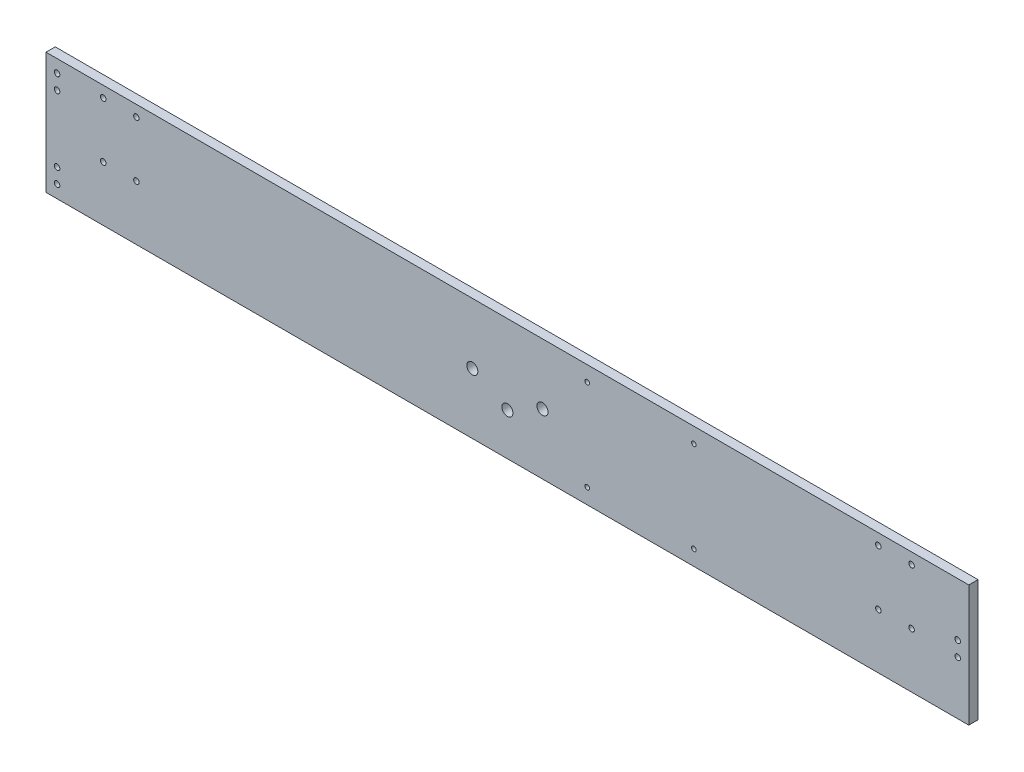
ISO-10303-21;
HEADER;
FILE_DESCRIPTION(('STEP AP214'),'2;1');
FILE_NAME('part.step','',(''),(''),'','','');
FILE_SCHEMA(('AUTOMOTIVE_DESIGN { 1 0 10303 214 1 1 1 1 }'));
ENDSEC;
DATA;
#1=APPLICATION_CONTEXT('core data for automotive mechanical design processes');
#2=APPLICATION_PROTOCOL_DEFINITION('international standard','automotive_design',2000,#1);
#3=PRODUCT_CONTEXT('',#1,'mechanical');
#4=PRODUCT('Part','Part','',(#3));
#5=PRODUCT_RELATED_PRODUCT_CATEGORY('part','',(#4));
#6=PRODUCT_DEFINITION_FORMATION('','',#4);
#7=PRODUCT_DEFINITION_CONTEXT('part definition',#1,'design');
#8=PRODUCT_DEFINITION('design','',#6,#7);
#9=PRODUCT_DEFINITION_SHAPE('','',#8);
#10=(LENGTH_UNIT() NAMED_UNIT(*) SI_UNIT(.MILLI.,.METRE.));
#11=(NAMED_UNIT(*) PLANE_ANGLE_UNIT() SI_UNIT($,.RADIAN.));
#12=(NAMED_UNIT(*) SI_UNIT($,.STERADIAN.) SOLID_ANGLE_UNIT());
#13=UNCERTAINTY_MEASURE_WITH_UNIT(LENGTH_MEASURE(1.E-05),#10,'distance_accuracy_value','');
#14=(GEOMETRIC_REPRESENTATION_CONTEXT(3) GLOBAL_UNCERTAINTY_ASSIGNED_CONTEXT((#13)) GLOBAL_UNIT_ASSIGNED_CONTEXT((#10,
#11,#12)) REPRESENTATION_CONTEXT('',''));
#15=CARTESIAN_POINT('',(0.,0.,0.));
#16=DIRECTION('',(0.,0.,1.));
#17=DIRECTION('',(1.,0.,0.));
#18=AXIS2_PLACEMENT_3D('',#15,#16,#17);
#19=CARTESIAN_POINT('',(0.,0.,5.));
#20=DIRECTION('',(0.,0.,1.));
#21=DIRECTION('',(1.,0.,0.));
#22=AXIS2_PLACEMENT_3D('',#19,#20,#21);
#23=PLANE('',#22);
#24=CARTESIAN_POINT('',(19.,0.,5.));
#25=DIRECTION('',(0.,0.,1.));
#26=DIRECTION('',(1.,0.,0.));
#27=AXIS2_PLACEMENT_3D('',#24,#25,#26);
#28=CIRCLE('',#27,3.);
#29=CARTESIAN_POINT('',(22.,0.,5.));
#30=VERTEX_POINT('',#29);
#31=EDGE_CURVE('E118',#30,#30,#28,.T.);
#32=ORIENTED_EDGE('',*,*,#31,.F.);
#33=EDGE_LOOP('',(#32));
#34=FACE_BOUND('',#33,.T.);
#35=CARTESIAN_POINT('',(-19.,0.,5.));
#36=DIRECTION('',(0.,0.,1.));
#37=DIRECTION('',(1.,0.,0.));
#38=AXIS2_PLACEMENT_3D('',#35,#36,#37);
#39=CIRCLE('',#38,3.);
#40=CARTESIAN_POINT('',(-16.,0.,5.));
#41=VERTEX_POINT('',#40);
#42=EDGE_CURVE('E501',#41,#41,#39,.T.);
#43=ORIENTED_EDGE('',*,*,#42,.F.);
#44=EDGE_LOOP('',(#43));
#45=FACE_BOUND('',#44,.T.);
#46=CARTESIAN_POINT('',(0.,-10.,5.));
#47=DIRECTION('',(0.,0.,1.));
#48=DIRECTION('',(1.,0.,0.));
#49=AXIS2_PLACEMENT_3D('',#46,#47,#48);
#50=CIRCLE('',#49,3.);
#51=CARTESIAN_POINT('',(3.,-10.,5.));
#52=VERTEX_POINT('',#51);
#53=EDGE_CURVE('E504',#52,#52,#50,.T.);
#54=ORIENTED_EDGE('',*,*,#53,.F.);
#55=EDGE_LOOP('',(#54));
#56=FACE_BOUND('',#55,.T.);
#57=CARTESIAN_POINT('',(-244.,26.,5.));
#58=DIRECTION('',(0.,0.,1.));
#59=DIRECTION('',(1.,0.,0.));
#60=AXIS2_PLACEMENT_3D('',#57,#58,#59);
#61=CIRCLE('',#60,1.5);
#62=CARTESIAN_POINT('',(-242.5,26.,5.));
#63=VERTEX_POINT('',#62);
#64=EDGE_CURVE('E139',#63,#63,#61,.T.);
#65=ORIENTED_EDGE('',*,*,#64,.F.);
#66=EDGE_LOOP('',(#65));
#67=FACE_BOUND('',#66,.T.);
#68=CARTESIAN_POINT('',(244.,3.99999999999997,5.));
#69=DIRECTION('',(0.,0.,1.));
#70=DIRECTION('',(1.,0.,0.));
#71=AXIS2_PLACEMENT_3D('',#68,#69,#70);
#72=CIRCLE('',#71,1.5);
#73=CARTESIAN_POINT('',(245.5,3.99999999999997,5.));
#74=VERTEX_POINT('',#73);
#75=EDGE_CURVE('E146',#74,#74,#72,.F.);
#76=ORIENTED_EDGE('',*,*,#75,.T.);
#77=EDGE_LOOP('',(#76));
#78=FACE_BOUND('',#77,.T.);
#79=CARTESIAN_POINT('',(-244.,18.,5.));
#80=DIRECTION('',(0.,0.,1.));
#81=DIRECTION('',(1.,0.,0.));
#82=AXIS2_PLACEMENT_3D('',#79,#80,#81);
#83=CIRCLE('',#82,1.5);
#84=CARTESIAN_POINT('',(-242.5,18.,5.));
#85=VERTEX_POINT('',#84);
#86=EDGE_CURVE('E140',#85,#85,#83,.T.);
#87=ORIENTED_EDGE('',*,*,#86,.F.);
#88=EDGE_LOOP('',(#87));
#89=FACE_BOUND('',#88,.T.);
#90=CARTESIAN_POINT('',(201.,-3.09999999999995,5.));
#91=DIRECTION('',(0.,0.,1.));
#92=DIRECTION('',(-1.,0.,0.));
#93=AXIS2_PLACEMENT_3D('',#90,#91,#92);
#94=CIRCLE('',#93,1.5);
#95=CARTESIAN_POINT('',(199.5,-3.09999999999995,5.));
#96=VERTEX_POINT('',#95);
#97=EDGE_CURVE('E187',#96,#96,#94,.T.);
#98=ORIENTED_EDGE('',*,*,#97,.F.);
#99=EDGE_LOOP('',(#98));
#100=FACE_BOUND('',#99,.T.);
#101=CARTESIAN_POINT('',(-219.,26.9,5.));
#102=DIRECTION('',(0.,0.,1.));
#103=DIRECTION('',(-1.,0.,0.));
#104=AXIS2_PLACEMENT_3D('',#101,#102,#103);
#105=CIRCLE('',#104,1.5);
#106=CARTESIAN_POINT('',(-220.5,26.9,5.));
#107=VERTEX_POINT('',#106);
#108=EDGE_CURVE('E180',#107,#107,#105,.T.);
#109=ORIENTED_EDGE('',*,*,#108,.F.);
#110=EDGE_LOOP('',(#109));
#111=FACE_BOUND('',#110,.T.);
#112=CARTESIAN_POINT('',(-219.,-3.1,5.));
#113=DIRECTION('',(0.,0.,1.));
#114=DIRECTION('',(-1.,0.,0.));
#115=AXIS2_PLACEMENT_3D('',#112,#113,#114);
#116=CIRCLE('',#115,1.5);
#117=CARTESIAN_POINT('',(-220.5,-3.1,5.));
#118=VERTEX_POINT('',#117);
#119=EDGE_CURVE('E199',#118,#118,#116,.T.);
#120=ORIENTED_EDGE('',*,*,#119,.F.);
#121=EDGE_LOOP('',(#120));
#122=FACE_BOUND('',#121,.T.);
#123=CARTESIAN_POINT('',(219.,-3.09999999999995,5.));
#124=DIRECTION('',(0.,0.,1.));
#125=DIRECTION('',(1.,0.,0.));
#126=AXIS2_PLACEMENT_3D('',#123,#124,#125);
#127=CIRCLE('',#126,1.5);
#128=CARTESIAN_POINT('',(220.5,-3.09999999999995,5.));
#129=VERTEX_POINT('',#128);
#130=EDGE_CURVE('E192',#129,#129,#127,.T.);
#131=ORIENTED_EDGE('',*,*,#130,.F.);
#132=EDGE_LOOP('',(#131));
#133=FACE_BOUND('',#132,.T.);
#134=CARTESIAN_POINT('',(-201.,26.9000000000001,5.));
#135=DIRECTION('',(0.,0.,1.));
#136=DIRECTION('',(1.,0.,0.));
#137=AXIS2_PLACEMENT_3D('',#134,#135,#136);
#138=CIRCLE('',#137,1.5);
#139=CARTESIAN_POINT('',(-199.5,26.9000000000001,5.));
#140=VERTEX_POINT('',#139);
#141=EDGE_CURVE('E160',#140,#140,#138,.T.);
#142=ORIENTED_EDGE('',*,*,#141,.F.);
#143=EDGE_LOOP('',(#142));
#144=FACE_BOUND('',#143,.T.);
#145=CARTESIAN_POINT('',(-201.,-3.09999999999995,5.));
#146=DIRECTION('',(0.,0.,1.));
#147=DIRECTION('',(1.,0.,0.));
#148=AXIS2_PLACEMENT_3D('',#145,#146,#147);
#149=CIRCLE('',#148,1.5);
#150=CARTESIAN_POINT('',(-199.5,-3.09999999999995,5.));
#151=VERTEX_POINT('',#150);
#152=EDGE_CURVE('E175',#151,#151,#149,.T.);
#153=ORIENTED_EDGE('',*,*,#152,.F.);
#154=EDGE_LOOP('',(#153));
#155=FACE_BOUND('',#154,.T.);
#156=CARTESIAN_POINT('',(201.,26.9000000000001,5.));
#157=DIRECTION('',(0.,0.,1.));
#158=DIRECTION('',(-1.,0.,0.));
#159=AXIS2_PLACEMENT_3D('',#156,#157,#158);
#160=CIRCLE('',#159,1.5);
#161=CARTESIAN_POINT('',(199.5,26.9000000000001,5.));
#162=VERTEX_POINT('',#161);
#163=EDGE_CURVE('E168',#162,#162,#160,.T.);
#164=ORIENTED_EDGE('',*,*,#163,.F.);
#165=EDGE_LOOP('',(#164));
#166=FACE_BOUND('',#165,.T.);
#167=CARTESIAN_POINT('',(219.,26.9000000000001,5.));
#168=DIRECTION('',(0.,0.,1.));
#169=DIRECTION('',(1.,0.,0.));
#170=AXIS2_PLACEMENT_3D('',#167,#168,#169);
#171=CIRCLE('',#170,1.5);
#172=CARTESIAN_POINT('',(220.5,26.9000000000001,5.));
#173=VERTEX_POINT('',#172);
#174=EDGE_CURVE('E195',#173,#173,#171,.T.);
#175=ORIENTED_EDGE('',*,*,#174,.F.);
#176=EDGE_LOOP('',(#175));
#177=FACE_BOUND('',#176,.T.);
#178=CARTESIAN_POINT('',(101.05,-24.65,5.));
#179=DIRECTION('',(0.,0.,1.));
#180=DIRECTION('',(1.,0.,0.));
#181=AXIS2_PLACEMENT_3D('',#178,#179,#180);
#182=CIRCLE('',#181,1.25);
#183=CARTESIAN_POINT('',(102.3,-24.65,5.));
#184=VERTEX_POINT('',#183);
#185=EDGE_CURVE('E216',#184,#184,#182,.T.);
#186=ORIENTED_EDGE('',*,*,#185,.F.);
#187=EDGE_LOOP('',(#186));
#188=FACE_BOUND('',#187,.T.);
#189=CARTESIAN_POINT('',(43.25,24.65,5.));
#190=DIRECTION('',(0.,0.,1.));
#191=DIRECTION('',(1.,0.,0.));
#192=AXIS2_PLACEMENT_3D('',#189,#190,#191);
#193=CIRCLE('',#192,1.25);
#194=CARTESIAN_POINT('',(44.5,24.65,5.));
#195=VERTEX_POINT('',#194);
#196=EDGE_CURVE('E109',#195,#195,#193,.T.);
#197=ORIENTED_EDGE('',*,*,#196,.F.);
#198=EDGE_LOOP('',(#197));
#199=FACE_BOUND('',#198,.T.);
#200=DIRECTION('',(0.,-1.,0.));
#201=VECTOR('',#200,1.);
#202=CARTESIAN_POINT('',(-250.,-32.9,5.));
#203=LINE('',#202,#201);
#204=CARTESIAN_POINT('',(-250.,32.9,5.));
#205=VERTEX_POINT('',#204);
#206=CARTESIAN_POINT('',(-250.,-32.9,5.));
#207=VERTEX_POINT('',#206);
#208=EDGE_CURVE('E93',#205,#207,#203,.T.);
#209=ORIENTED_EDGE('',*,*,#208,.T.);
#210=DIRECTION('',(1.,0.,0.));
#211=VECTOR('',#210,1.);
#212=CARTESIAN_POINT('',(250.,-32.9,5.));
#213=LINE('',#212,#211);
#214=CARTESIAN_POINT('',(250.,-32.9,5.));
#215=VERTEX_POINT('',#214);
#216=EDGE_CURVE('E88',#207,#215,#213,.T.);
#217=ORIENTED_EDGE('',*,*,#216,.T.);
#218=DIRECTION('',(0.,1.,0.));
#219=VECTOR('',#218,1.);
#220=CARTESIAN_POINT('',(250.,-32.9,5.));
#221=LINE('',#220,#219);
#222=CARTESIAN_POINT('',(250.,32.9,5.));
#223=VERTEX_POINT('',#222);
#224=EDGE_CURVE('E91',#215,#223,#221,.T.);
#225=ORIENTED_EDGE('',*,*,#224,.T.);
#226=DIRECTION('',(-1.,0.,0.));
#227=VECTOR('',#226,1.);
#228=CARTESIAN_POINT('',(250.,32.9,5.));
#229=LINE('',#228,#227);
#230=EDGE_CURVE('E58',#223,#205,#229,.T.);
#231=ORIENTED_EDGE('',*,*,#230,.T.);
#232=EDGE_LOOP('',(#209,#217,#225,#231));
#233=FACE_BOUND('',#232,.T.);
#234=CARTESIAN_POINT('',(43.25,-24.65,5.));
#235=DIRECTION('',(0.,0.,1.));
#236=DIRECTION('',(1.,0.,0.));
#237=AXIS2_PLACEMENT_3D('',#234,#235,#236);
#238=CIRCLE('',#237,1.25);
#239=CARTESIAN_POINT('',(44.5,-24.65,5.));
#240=VERTEX_POINT('',#239);
#241=EDGE_CURVE('E222',#240,#240,#238,.T.);
#242=ORIENTED_EDGE('',*,*,#241,.F.);
#243=EDGE_LOOP('',(#242));
#244=FACE_BOUND('',#243,.T.);
#245=CARTESIAN_POINT('',(101.05,24.65,5.));
#246=DIRECTION('',(0.,0.,1.));
#247=DIRECTION('',(1.,0.,0.));
#248=AXIS2_PLACEMENT_3D('',#245,#246,#247);
#249=CIRCLE('',#248,1.25);
#250=CARTESIAN_POINT('',(102.3,24.65,5.));
#251=VERTEX_POINT('',#250);
#252=EDGE_CURVE('E210',#251,#251,#249,.T.);
#253=ORIENTED_EDGE('',*,*,#252,.F.);
#254=EDGE_LOOP('',(#253));
#255=FACE_BOUND('',#254,.T.);
#256=CARTESIAN_POINT('',(-244.,-18.,5.));
#257=DIRECTION('',(0.,0.,1.));
#258=DIRECTION('',(1.,0.,0.));
#259=AXIS2_PLACEMENT_3D('',#256,#257,#258);
#260=CIRCLE('',#259,1.5);
#261=CARTESIAN_POINT('',(-242.5,-18.,5.));
#262=VERTEX_POINT('',#261);
#263=EDGE_CURVE('E152',#262,#262,#260,.T.);
#264=ORIENTED_EDGE('',*,*,#263,.F.);
#265=EDGE_LOOP('',(#264));
#266=FACE_BOUND('',#265,.T.);
#267=CARTESIAN_POINT('',(-244.,-26.,5.));
#268=DIRECTION('',(0.,0.,1.));
#269=DIRECTION('',(1.,0.,0.));
#270=AXIS2_PLACEMENT_3D('',#267,#268,#269);
#271=CIRCLE('',#270,1.5);
#272=CARTESIAN_POINT('',(-242.5,-26.,5.));
#273=VERTEX_POINT('',#272);
#274=EDGE_CURVE('E132',#273,#273,#271,.T.);
#275=ORIENTED_EDGE('',*,*,#274,.F.);
#276=EDGE_LOOP('',(#275));
#277=FACE_BOUND('',#276,.T.);
#278=CARTESIAN_POINT('',(244.,-4.00000000000003,5.));
#279=DIRECTION('',(0.,0.,1.));
#280=DIRECTION('',(1.,0.,0.));
#281=AXIS2_PLACEMENT_3D('',#278,#279,#280);
#282=CIRCLE('',#281,1.5);
#283=CARTESIAN_POINT('',(245.5,-4.00000000000003,5.));
#284=VERTEX_POINT('',#283);
#285=EDGE_CURVE('E123',#284,#284,#282,.F.);
#286=ORIENTED_EDGE('',*,*,#285,.T.);
#287=EDGE_LOOP('',(#286));
#288=FACE_BOUND('',#287,.T.);
#289=ADVANCED_FACE('F39',(#34,#45,#56,#67,#78,#89,#100,#111,#122,#133,#144,#155,#166,#177,#188,
#199,#233,#244,#255,#266,#277,#288),#23,.T.);
#290=CARTESIAN_POINT('',(0.,0.,0.));
#291=DIRECTION('',(0.,0.,1.));
#292=DIRECTION('',(1.,0.,0.));
#293=AXIS2_PLACEMENT_3D('',#290,#291,#292);
#294=PLANE('',#293);
#295=CARTESIAN_POINT('',(19.,0.,0.));
#296=DIRECTION('',(0.,0.,1.));
#297=DIRECTION('',(1.,0.,0.));
#298=AXIS2_PLACEMENT_3D('',#295,#296,#297);
#299=CIRCLE('',#298,3.);
#300=CARTESIAN_POINT('',(22.,0.,0.));
#301=VERTEX_POINT('',#300);
#302=EDGE_CURVE('E43',#301,#301,#299,.T.);
#303=ORIENTED_EDGE('',*,*,#302,.T.);
#304=EDGE_LOOP('',(#303));
#305=FACE_BOUND('',#304,.T.);
#306=CARTESIAN_POINT('',(-19.,0.,0.));
#307=DIRECTION('',(0.,0.,1.));
#308=DIRECTION('',(1.,0.,0.));
#309=AXIS2_PLACEMENT_3D('',#306,#307,#308);
#310=CIRCLE('',#309,3.);
#311=CARTESIAN_POINT('',(-16.,0.,0.));
#312=VERTEX_POINT('',#311);
#313=EDGE_CURVE('E117',#312,#312,#310,.T.);
#314=ORIENTED_EDGE('',*,*,#313,.T.);
#315=EDGE_LOOP('',(#314));
#316=FACE_BOUND('',#315,.T.);
#317=CARTESIAN_POINT('',(0.,-10.,0.));
#318=DIRECTION('',(0.,0.,1.));
#319=DIRECTION('',(1.,0.,0.));
#320=AXIS2_PLACEMENT_3D('',#317,#318,#319);
#321=CIRCLE('',#320,3.);
#322=CARTESIAN_POINT('',(3.,-10.,0.));
#323=VERTEX_POINT('',#322);
#324=EDGE_CURVE('E115',#323,#323,#321,.T.);
#325=ORIENTED_EDGE('',*,*,#324,.T.);
#326=EDGE_LOOP('',(#325));
#327=FACE_BOUND('',#326,.T.);
#328=CARTESIAN_POINT('',(-244.,26.,0.));
#329=DIRECTION('',(0.,0.,1.));
#330=DIRECTION('',(1.,0.,0.));
#331=AXIS2_PLACEMENT_3D('',#328,#329,#330);
#332=CIRCLE('',#331,1.5);
#333=CARTESIAN_POINT('',(-242.5,26.,0.));
#334=VERTEX_POINT('',#333);
#335=EDGE_CURVE('E167',#334,#334,#332,.T.);
#336=ORIENTED_EDGE('',*,*,#335,.T.);
#337=EDGE_LOOP('',(#336));
#338=FACE_BOUND('',#337,.T.);
#339=CARTESIAN_POINT('',(-244.,-26.,0.));
#340=DIRECTION('',(0.,0.,1.));
#341=DIRECTION('',(1.,0.,0.));
#342=AXIS2_PLACEMENT_3D('',#339,#340,#341);
#343=CIRCLE('',#342,1.5);
#344=CARTESIAN_POINT('',(-242.5,-26.,0.));
#345=VERTEX_POINT('',#344);
#346=EDGE_CURVE('E155',#345,#345,#343,.T.);
#347=ORIENTED_EDGE('',*,*,#346,.T.);
#348=EDGE_LOOP('',(#347));
#349=FACE_BOUND('',#348,.T.);
#350=CARTESIAN_POINT('',(-244.,-18.,0.));
#351=DIRECTION('',(0.,0.,1.));
#352=DIRECTION('',(1.,0.,0.));
#353=AXIS2_PLACEMENT_3D('',#350,#351,#352);
#354=CIRCLE('',#353,1.5);
#355=CARTESIAN_POINT('',(-242.5,-18.,0.));
#356=VERTEX_POINT('',#355);
#357=EDGE_CURVE('E149',#356,#356,#354,.T.);
#358=ORIENTED_EDGE('',*,*,#357,.T.);
#359=EDGE_LOOP('',(#358));
#360=FACE_BOUND('',#359,.T.);
#361=CARTESIAN_POINT('',(-244.,18.,0.));
#362=DIRECTION('',(0.,0.,1.));
#363=DIRECTION('',(1.,0.,0.));
#364=AXIS2_PLACEMENT_3D('',#361,#362,#363);
#365=CIRCLE('',#364,1.5);
#366=CARTESIAN_POINT('',(-242.5,18.,0.));
#367=VERTEX_POINT('',#366);
#368=EDGE_CURVE('E136',#367,#367,#365,.T.);
#369=ORIENTED_EDGE('',*,*,#368,.T.);
#370=EDGE_LOOP('',(#369));
#371=FACE_BOUND('',#370,.T.);
#372=CARTESIAN_POINT('',(201.,-3.09999999999995,0.));
#373=DIRECTION('',(0.,0.,1.));
#374=DIRECTION('',(-1.,0.,0.));
#375=AXIS2_PLACEMENT_3D('',#372,#373,#374);
#376=CIRCLE('',#375,1.5);
#377=CARTESIAN_POINT('',(199.5,-3.09999999999995,0.));
#378=VERTEX_POINT('',#377);
#379=EDGE_CURVE('E171',#378,#378,#376,.T.);
#380=ORIENTED_EDGE('',*,*,#379,.T.);
#381=EDGE_LOOP('',(#380));
#382=FACE_BOUND('',#381,.T.);
#383=CARTESIAN_POINT('',(-219.,26.9,0.));
#384=DIRECTION('',(0.,0.,1.));
#385=DIRECTION('',(-1.,0.,0.));
#386=AXIS2_PLACEMENT_3D('',#383,#384,#385);
#387=CIRCLE('',#386,1.5);
#388=CARTESIAN_POINT('',(-220.5,26.9,0.));
#389=VERTEX_POINT('',#388);
#390=EDGE_CURVE('E184',#389,#389,#387,.T.);
#391=ORIENTED_EDGE('',*,*,#390,.T.);
#392=EDGE_LOOP('',(#391));
#393=FACE_BOUND('',#392,.T.);
#394=CARTESIAN_POINT('',(-219.,-3.1,0.));
#395=DIRECTION('',(0.,0.,1.));
#396=DIRECTION('',(-1.,0.,0.));
#397=AXIS2_PLACEMENT_3D('',#394,#395,#396);
#398=CIRCLE('',#397,1.5);
#399=CARTESIAN_POINT('',(-220.5,-3.1,0.));
#400=VERTEX_POINT('',#399);
#401=EDGE_CURVE('E183',#400,#400,#398,.T.);
#402=ORIENTED_EDGE('',*,*,#401,.T.);
#403=EDGE_LOOP('',(#402));
#404=FACE_BOUND('',#403,.T.);
#405=CARTESIAN_POINT('',(219.,-3.09999999999995,0.));
#406=DIRECTION('',(0.,0.,1.));
#407=DIRECTION('',(1.,0.,0.));
#408=AXIS2_PLACEMENT_3D('',#405,#406,#407);
#409=CIRCLE('',#408,1.5);
#410=CARTESIAN_POINT('',(220.5,-3.09999999999995,0.));
#411=VERTEX_POINT('',#410);
#412=EDGE_CURVE('E196',#411,#411,#409,.T.);
#413=ORIENTED_EDGE('',*,*,#412,.T.);
#414=EDGE_LOOP('',(#413));
#415=FACE_BOUND('',#414,.T.);
#416=CARTESIAN_POINT('',(-201.,26.9000000000001,0.));
#417=DIRECTION('',(0.,0.,1.));
#418=DIRECTION('',(1.,0.,0.));
#419=AXIS2_PLACEMENT_3D('',#416,#417,#418);
#420=CIRCLE('',#419,1.5);
#421=CARTESIAN_POINT('',(-199.5,26.9000000000001,0.));
#422=VERTEX_POINT('',#421);
#423=EDGE_CURVE('E164',#422,#422,#420,.T.);
#424=ORIENTED_EDGE('',*,*,#423,.T.);
#425=EDGE_LOOP('',(#424));
#426=FACE_BOUND('',#425,.T.);
#427=CARTESIAN_POINT('',(-201.,-3.09999999999995,0.));
#428=DIRECTION('',(0.,0.,1.));
#429=DIRECTION('',(1.,0.,0.));
#430=AXIS2_PLACEMENT_3D('',#427,#428,#429);
#431=CIRCLE('',#430,1.5);
#432=CARTESIAN_POINT('',(-199.5,-3.09999999999995,0.));
#433=VERTEX_POINT('',#432);
#434=EDGE_CURVE('E163',#433,#433,#431,.T.);
#435=ORIENTED_EDGE('',*,*,#434,.T.);
#436=EDGE_LOOP('',(#435));
#437=FACE_BOUND('',#436,.T.);
#438=CARTESIAN_POINT('',(201.,26.9000000000001,0.));
#439=DIRECTION('',(0.,0.,1.));
#440=DIRECTION('',(-1.,0.,0.));
#441=AXIS2_PLACEMENT_3D('',#438,#439,#440);
#442=CIRCLE('',#441,1.5);
#443=CARTESIAN_POINT('',(199.5,26.9000000000001,0.));
#444=VERTEX_POINT('',#443);
#445=EDGE_CURVE('E172',#444,#444,#442,.T.);
#446=ORIENTED_EDGE('',*,*,#445,.T.);
#447=EDGE_LOOP('',(#446));
#448=FACE_BOUND('',#447,.T.);
#449=CARTESIAN_POINT('',(219.,26.9000000000001,0.));
#450=DIRECTION('',(0.,0.,1.));
#451=DIRECTION('',(1.,0.,0.));
#452=AXIS2_PLACEMENT_3D('',#449,#450,#451);
#453=CIRCLE('',#452,1.5);
#454=CARTESIAN_POINT('',(220.5,26.9000000000001,0.));
#455=VERTEX_POINT('',#454);
#456=EDGE_CURVE('E204',#455,#455,#453,.T.);
#457=ORIENTED_EDGE('',*,*,#456,.T.);
#458=EDGE_LOOP('',(#457));
#459=FACE_BOUND('',#458,.T.);
#460=DIRECTION('',(0.,-1.,0.));
#461=VECTOR('',#460,1.);
#462=CARTESIAN_POINT('',(-250.,-32.9,0.));
#463=LINE('',#462,#461);
#464=CARTESIAN_POINT('',(-250.,32.9,0.));
#465=VERTEX_POINT('',#464);
#466=CARTESIAN_POINT('',(-250.,-32.9,0.));
#467=VERTEX_POINT('',#466);
#468=EDGE_CURVE('E106',#465,#467,#463,.T.);
#469=ORIENTED_EDGE('',*,*,#468,.F.);
#470=DIRECTION('',(-1.,0.,0.));
#471=VECTOR('',#470,1.);
#472=CARTESIAN_POINT('',(250.,32.9,0.));
#473=LINE('',#472,#471);
#474=CARTESIAN_POINT('',(250.,32.9,0.));
#475=VERTEX_POINT('',#474);
#476=EDGE_CURVE('E81',#475,#465,#473,.T.);
#477=ORIENTED_EDGE('',*,*,#476,.F.);
#478=DIRECTION('',(0.,1.,0.));
#479=VECTOR('',#478,1.);
#480=CARTESIAN_POINT('',(250.,-32.9,0.));
#481=LINE('',#480,#479);
#482=CARTESIAN_POINT('',(250.,-32.9,0.));
#483=VERTEX_POINT('',#482);
#484=EDGE_CURVE('E75',#483,#475,#481,.T.);
#485=ORIENTED_EDGE('',*,*,#484,.F.);
#486=DIRECTION('',(1.,0.,0.));
#487=VECTOR('',#486,1.);
#488=CARTESIAN_POINT('',(250.,-32.9,0.));
#489=LINE('',#488,#487);
#490=EDGE_CURVE('E97',#467,#483,#489,.T.);
#491=ORIENTED_EDGE('',*,*,#490,.F.);
#492=EDGE_LOOP('',(#469,#477,#485,#491));
#493=FACE_BOUND('',#492,.T.);
#494=CARTESIAN_POINT('',(43.25,24.65,0.));
#495=DIRECTION('',(0.,0.,1.));
#496=DIRECTION('',(1.,0.,0.));
#497=AXIS2_PLACEMENT_3D('',#494,#495,#496);
#498=CIRCLE('',#497,1.25);
#499=CARTESIAN_POINT('',(44.5,24.65,0.));
#500=VERTEX_POINT('',#499);
#501=EDGE_CURVE('E225',#500,#500,#498,.T.);
#502=ORIENTED_EDGE('',*,*,#501,.T.);
#503=EDGE_LOOP('',(#502));
#504=FACE_BOUND('',#503,.T.);
#505=CARTESIAN_POINT('',(43.25,-24.65,0.));
#506=DIRECTION('',(0.,0.,1.));
#507=DIRECTION('',(1.,0.,0.));
#508=AXIS2_PLACEMENT_3D('',#505,#506,#507);
#509=CIRCLE('',#508,1.25);
#510=CARTESIAN_POINT('',(44.5,-24.65,0.));
#511=VERTEX_POINT('',#510);
#512=EDGE_CURVE('E219',#511,#511,#509,.T.);
#513=ORIENTED_EDGE('',*,*,#512,.T.);
#514=EDGE_LOOP('',(#513));
#515=FACE_BOUND('',#514,.T.);
#516=CARTESIAN_POINT('',(101.05,-24.65,0.));
#517=DIRECTION('',(0.,0.,1.));
#518=DIRECTION('',(1.,0.,0.));
#519=AXIS2_PLACEMENT_3D('',#516,#517,#518);
#520=CIRCLE('',#519,1.25);
#521=CARTESIAN_POINT('',(102.3,-24.65,0.));
#522=VERTEX_POINT('',#521);
#523=EDGE_CURVE('E213',#522,#522,#520,.T.);
#524=ORIENTED_EDGE('',*,*,#523,.T.);
#525=EDGE_LOOP('',(#524));
#526=FACE_BOUND('',#525,.T.);
#527=CARTESIAN_POINT('',(101.05,24.65,0.));
#528=DIRECTION('',(0.,0.,1.));
#529=DIRECTION('',(1.,0.,0.));
#530=AXIS2_PLACEMENT_3D('',#527,#528,#529);
#531=CIRCLE('',#530,1.25);
#532=CARTESIAN_POINT('',(102.3,24.65,0.));
#533=VERTEX_POINT('',#532);
#534=EDGE_CURVE('E207',#533,#533,#531,.T.);
#535=ORIENTED_EDGE('',*,*,#534,.T.);
#536=EDGE_LOOP('',(#535));
#537=FACE_BOUND('',#536,.T.);
#538=CARTESIAN_POINT('',(244.,3.99999999999997,0.));
#539=DIRECTION('',(0.,0.,1.));
#540=DIRECTION('',(1.,0.,0.));
#541=AXIS2_PLACEMENT_3D('',#538,#539,#540);
#542=CIRCLE('',#541,1.5);
#543=CARTESIAN_POINT('',(245.5,3.99999999999997,0.));
#544=VERTEX_POINT('',#543);
#545=EDGE_CURVE('E143',#544,#544,#542,.F.);
#546=ORIENTED_EDGE('',*,*,#545,.F.);
#547=EDGE_LOOP('',(#546));
#548=FACE_BOUND('',#547,.T.);
#549=CARTESIAN_POINT('',(244.,-4.00000000000003,0.));
#550=DIRECTION('',(0.,0.,1.));
#551=DIRECTION('',(1.,0.,0.));
#552=AXIS2_PLACEMENT_3D('',#549,#550,#551);
#553=CIRCLE('',#552,1.5);
#554=CARTESIAN_POINT('',(245.5,-4.00000000000003,0.));
#555=VERTEX_POINT('',#554);
#556=EDGE_CURVE('E127',#555,#555,#553,.F.);
#557=ORIENTED_EDGE('',*,*,#556,.F.);
#558=EDGE_LOOP('',(#557));
#559=FACE_BOUND('',#558,.T.);
#560=ADVANCED_FACE('F233',(#305,#316,#327,#338,#349,#360,#371,#382,#393,#404,#415,#426,#437,
#448,#459,#493,#504,#515,#526,#537,#548,#559),#294,.F.);
#561=CARTESIAN_POINT('',(-250.,-32.9,5.));
#562=DIRECTION('',(1.,0.,0.));
#563=DIRECTION('',(0.,0.,-1.));
#564=AXIS2_PLACEMENT_3D('',#561,#562,#563);
#565=PLANE('',#564);
#566=ORIENTED_EDGE('',*,*,#468,.T.);
#567=DIRECTION('',(0.,0.,-1.));
#568=VECTOR('',#567,1.);
#569=CARTESIAN_POINT('',(-250.,-32.9,5.));
#570=LINE('',#569,#568);
#571=EDGE_CURVE('E11',#207,#467,#570,.T.);
#572=ORIENTED_EDGE('',*,*,#571,.F.);
#573=ORIENTED_EDGE('',*,*,#208,.F.);
#574=DIRECTION('',(0.,0.,-1.));
#575=VECTOR('',#574,1.);
#576=CARTESIAN_POINT('',(-250.,32.9,5.));
#577=LINE('',#576,#575);
#578=EDGE_CURVE('E102',#205,#465,#577,.T.);
#579=ORIENTED_EDGE('',*,*,#578,.T.);
#580=EDGE_LOOP('',(#566,#572,#573,#579));
#581=FACE_BOUND('',#580,.T.);
#582=ADVANCED_FACE('F41',(#581),#565,.F.);
#583=CARTESIAN_POINT('',(250.,-32.9,5.));
#584=DIRECTION('',(0.,1.,0.));
#585=DIRECTION('',(-1.,0.,0.));
#586=AXIS2_PLACEMENT_3D('',#583,#584,#585);
#587=PLANE('',#586);
#588=ORIENTED_EDGE('',*,*,#490,.T.);
#589=DIRECTION('',(0.,0.,-1.));
#590=VECTOR('',#589,1.);
#591=CARTESIAN_POINT('',(250.,-32.9,5.));
#592=LINE('',#591,#590);
#593=EDGE_CURVE('E49',#215,#483,#592,.T.);
#594=ORIENTED_EDGE('',*,*,#593,.F.);
#595=ORIENTED_EDGE('',*,*,#216,.F.);
#596=ORIENTED_EDGE('',*,*,#571,.T.);
#597=EDGE_LOOP('',(#588,#594,#595,#596));
#598=FACE_BOUND('',#597,.T.);
#599=ADVANCED_FACE('F96',(#598),#587,.F.);
#600=CARTESIAN_POINT('',(250.,-32.9,5.));
#601=DIRECTION('',(-1.,0.,0.));
#602=DIRECTION('',(0.,0.,1.));
#603=AXIS2_PLACEMENT_3D('',#600,#601,#602);
#604=PLANE('',#603);
#605=ORIENTED_EDGE('',*,*,#484,.T.);
#606=DIRECTION('',(0.,0.,-1.));
#607=VECTOR('',#606,1.);
#608=CARTESIAN_POINT('',(250.,32.9,5.));
#609=LINE('',#608,#607);
#610=EDGE_CURVE('E98',#223,#475,#609,.T.);
#611=ORIENTED_EDGE('',*,*,#610,.F.);
#612=ORIENTED_EDGE('',*,*,#224,.F.);
#613=ORIENTED_EDGE('',*,*,#593,.T.);
#614=EDGE_LOOP('',(#605,#611,#612,#613));
#615=FACE_BOUND('',#614,.T.);
#616=ADVANCED_FACE('F100',(#615),#604,.F.);
#617=CARTESIAN_POINT('',(250.,32.9,5.));
#618=DIRECTION('',(0.,-1.,0.));
#619=DIRECTION('',(1.,0.,0.));
#620=AXIS2_PLACEMENT_3D('',#617,#618,#619);
#621=PLANE('',#620);
#622=ORIENTED_EDGE('',*,*,#476,.T.);
#623=ORIENTED_EDGE('',*,*,#578,.F.);
#624=ORIENTED_EDGE('',*,*,#230,.F.);
#625=ORIENTED_EDGE('',*,*,#610,.T.);
#626=EDGE_LOOP('',(#622,#623,#624,#625));
#627=FACE_BOUND('',#626,.T.);
#628=ADVANCED_FACE('F239',(#627),#621,.F.);
#629=CARTESIAN_POINT('',(43.25,24.65,5.));
#630=DIRECTION('',(0.,0.,-1.));
#631=DIRECTION('',(-1.,0.,0.));
#632=AXIS2_PLACEMENT_3D('',#629,#630,#631);
#633=CYLINDRICAL_SURFACE('',#632,1.25);
#634=ORIENTED_EDGE('',*,*,#196,.T.);
#635=EDGE_LOOP('',(#634));
#636=FACE_BOUND('',#635,.T.);
#637=ORIENTED_EDGE('',*,*,#501,.F.);
#638=EDGE_LOOP('',(#637));
#639=FACE_BOUND('',#638,.T.);
#640=ADVANCED_FACE('F236',(#636,#639),#633,.F.);
#641=CARTESIAN_POINT('',(43.25,-24.65,5.));
#642=DIRECTION('',(0.,0.,-1.));
#643=DIRECTION('',(-1.,0.,0.));
#644=AXIS2_PLACEMENT_3D('',#641,#642,#643);
#645=CYLINDRICAL_SURFACE('',#644,1.25);
#646=ORIENTED_EDGE('',*,*,#241,.T.);
#647=EDGE_LOOP('',(#646));
#648=FACE_BOUND('',#647,.T.);
#649=ORIENTED_EDGE('',*,*,#512,.F.);
#650=EDGE_LOOP('',(#649));
#651=FACE_BOUND('',#650,.T.);
#652=ADVANCED_FACE('F238',(#648,#651),#645,.F.);
#653=CARTESIAN_POINT('',(101.05,-24.65,5.));
#654=DIRECTION('',(0.,0.,-1.));
#655=DIRECTION('',(-1.,0.,0.));
#656=AXIS2_PLACEMENT_3D('',#653,#654,#655);
#657=CYLINDRICAL_SURFACE('',#656,1.25);
#658=ORIENTED_EDGE('',*,*,#185,.T.);
#659=EDGE_LOOP('',(#658));
#660=FACE_BOUND('',#659,.T.);
#661=ORIENTED_EDGE('',*,*,#523,.F.);
#662=EDGE_LOOP('',(#661));
#663=FACE_BOUND('',#662,.T.);
#664=ADVANCED_FACE('F246',(#660,#663),#657,.F.);
#665=CARTESIAN_POINT('',(101.05,24.65,5.));
#666=DIRECTION('',(0.,0.,-1.));
#667=DIRECTION('',(-1.,0.,0.));
#668=AXIS2_PLACEMENT_3D('',#665,#666,#667);
#669=CYLINDRICAL_SURFACE('',#668,1.25);
#670=ORIENTED_EDGE('',*,*,#252,.T.);
#671=EDGE_LOOP('',(#670));
#672=FACE_BOUND('',#671,.T.);
#673=ORIENTED_EDGE('',*,*,#534,.F.);
#674=EDGE_LOOP('',(#673));
#675=FACE_BOUND('',#674,.T.);
#676=ADVANCED_FACE('F307',(#672,#675),#669,.F.);
#677=CARTESIAN_POINT('',(219.,26.9000000000001,0.));
#678=DIRECTION('',(0.,0.,1.));
#679=DIRECTION('',(1.,0.,0.));
#680=AXIS2_PLACEMENT_3D('',#677,#678,#679);
#681=CYLINDRICAL_SURFACE('',#680,1.5);
#682=ORIENTED_EDGE('',*,*,#456,.F.);
#683=EDGE_LOOP('',(#682));
#684=FACE_BOUND('',#683,.T.);
#685=ORIENTED_EDGE('',*,*,#174,.T.);
#686=EDGE_LOOP('',(#685));
#687=FACE_BOUND('',#686,.T.);
#688=ADVANCED_FACE('F317',(#684,#687),#681,.F.);
#689=CARTESIAN_POINT('',(201.,26.9000000000001,0.));
#690=DIRECTION('',(0.,0.,1.));
#691=DIRECTION('',(1.,0.,0.));
#692=AXIS2_PLACEMENT_3D('',#689,#690,#691);
#693=CYLINDRICAL_SURFACE('',#692,1.5);
#694=ORIENTED_EDGE('',*,*,#445,.F.);
#695=EDGE_LOOP('',(#694));
#696=FACE_BOUND('',#695,.T.);
#697=ORIENTED_EDGE('',*,*,#163,.T.);
#698=EDGE_LOOP('',(#697));
#699=FACE_BOUND('',#698,.T.);
#700=ADVANCED_FACE('F327',(#696,#699),#693,.F.);
#701=CARTESIAN_POINT('',(-201.,-3.09999999999995,0.));
#702=DIRECTION('',(0.,0.,1.));
#703=DIRECTION('',(1.,0.,0.));
#704=AXIS2_PLACEMENT_3D('',#701,#702,#703);
#705=CYLINDRICAL_SURFACE('',#704,1.5);
#706=ORIENTED_EDGE('',*,*,#434,.F.);
#707=EDGE_LOOP('',(#706));
#708=FACE_BOUND('',#707,.T.);
#709=ORIENTED_EDGE('',*,*,#152,.T.);
#710=EDGE_LOOP('',(#709));
#711=FACE_BOUND('',#710,.T.);
#712=ADVANCED_FACE('F337',(#708,#711),#705,.F.);
#713=CARTESIAN_POINT('',(-201.,26.9000000000001,0.));
#714=DIRECTION('',(0.,0.,1.));
#715=DIRECTION('',(1.,0.,0.));
#716=AXIS2_PLACEMENT_3D('',#713,#714,#715);
#717=CYLINDRICAL_SURFACE('',#716,1.5);
#718=ORIENTED_EDGE('',*,*,#423,.F.);
#719=EDGE_LOOP('',(#718));
#720=FACE_BOUND('',#719,.T.);
#721=ORIENTED_EDGE('',*,*,#141,.T.);
#722=EDGE_LOOP('',(#721));
#723=FACE_BOUND('',#722,.T.);
#724=ADVANCED_FACE('F347',(#720,#723),#717,.F.);
#725=CARTESIAN_POINT('',(219.,-3.09999999999995,0.));
#726=DIRECTION('',(0.,0.,1.));
#727=DIRECTION('',(1.,0.,0.));
#728=AXIS2_PLACEMENT_3D('',#725,#726,#727);
#729=CYLINDRICAL_SURFACE('',#728,1.5);
#730=ORIENTED_EDGE('',*,*,#412,.F.);
#731=EDGE_LOOP('',(#730));
#732=FACE_BOUND('',#731,.T.);
#733=ORIENTED_EDGE('',*,*,#130,.T.);
#734=EDGE_LOOP('',(#733));
#735=FACE_BOUND('',#734,.T.);
#736=ADVANCED_FACE('F357',(#732,#735),#729,.F.);
#737=CARTESIAN_POINT('',(-219.,-3.1,0.));
#738=DIRECTION('',(0.,0.,1.));
#739=DIRECTION('',(1.,0.,0.));
#740=AXIS2_PLACEMENT_3D('',#737,#738,#739);
#741=CYLINDRICAL_SURFACE('',#740,1.5);
#742=ORIENTED_EDGE('',*,*,#401,.F.);
#743=EDGE_LOOP('',(#742));
#744=FACE_BOUND('',#743,.T.);
#745=ORIENTED_EDGE('',*,*,#119,.T.);
#746=EDGE_LOOP('',(#745));
#747=FACE_BOUND('',#746,.T.);
#748=ADVANCED_FACE('F367',(#744,#747),#741,.F.);
#749=CARTESIAN_POINT('',(-219.,26.9,0.));
#750=DIRECTION('',(0.,0.,1.));
#751=DIRECTION('',(1.,0.,0.));
#752=AXIS2_PLACEMENT_3D('',#749,#750,#751);
#753=CYLINDRICAL_SURFACE('',#752,1.5);
#754=ORIENTED_EDGE('',*,*,#390,.F.);
#755=EDGE_LOOP('',(#754));
#756=FACE_BOUND('',#755,.T.);
#757=ORIENTED_EDGE('',*,*,#108,.T.);
#758=EDGE_LOOP('',(#757));
#759=FACE_BOUND('',#758,.T.);
#760=ADVANCED_FACE('F377',(#756,#759),#753,.F.);
#761=CARTESIAN_POINT('',(201.,-3.09999999999995,0.));
#762=DIRECTION('',(0.,0.,1.));
#763=DIRECTION('',(1.,0.,0.));
#764=AXIS2_PLACEMENT_3D('',#761,#762,#763);
#765=CYLINDRICAL_SURFACE('',#764,1.5);
#766=ORIENTED_EDGE('',*,*,#379,.F.);
#767=EDGE_LOOP('',(#766));
#768=FACE_BOUND('',#767,.T.);
#769=ORIENTED_EDGE('',*,*,#97,.T.);
#770=EDGE_LOOP('',(#769));
#771=FACE_BOUND('',#770,.T.);
#772=ADVANCED_FACE('F387',(#768,#771),#765,.F.);
#773=CARTESIAN_POINT('',(-244.,18.,0.));
#774=DIRECTION('',(0.,0.,1.));
#775=DIRECTION('',(1.,0.,0.));
#776=AXIS2_PLACEMENT_3D('',#773,#774,#775);
#777=CYLINDRICAL_SURFACE('',#776,1.5);
#778=ORIENTED_EDGE('',*,*,#368,.F.);
#779=EDGE_LOOP('',(#778));
#780=FACE_BOUND('',#779,.T.);
#781=ORIENTED_EDGE('',*,*,#86,.T.);
#782=EDGE_LOOP('',(#781));
#783=FACE_BOUND('',#782,.T.);
#784=ADVANCED_FACE('F397',(#780,#783),#777,.F.);
#785=CARTESIAN_POINT('',(244.,3.99999999999997,0.));
#786=DIRECTION('',(0.,0.,1.));
#787=DIRECTION('',(1.,0.,0.));
#788=AXIS2_PLACEMENT_3D('',#785,#786,#787);
#789=CYLINDRICAL_SURFACE('',#788,1.5);
#790=ORIENTED_EDGE('',*,*,#545,.T.);
#791=EDGE_LOOP('',(#790));
#792=FACE_BOUND('',#791,.T.);
#793=ORIENTED_EDGE('',*,*,#75,.F.);
#794=EDGE_LOOP('',(#793));
#795=FACE_BOUND('',#794,.T.);
#796=ADVANCED_FACE('F418',(#792,#795),#789,.F.);
#797=CARTESIAN_POINT('',(-244.,-18.,0.));
#798=DIRECTION('',(0.,0.,1.));
#799=DIRECTION('',(1.,0.,0.));
#800=AXIS2_PLACEMENT_3D('',#797,#798,#799);
#801=CYLINDRICAL_SURFACE('',#800,1.5);
#802=ORIENTED_EDGE('',*,*,#357,.F.);
#803=EDGE_LOOP('',(#802));
#804=FACE_BOUND('',#803,.T.);
#805=ORIENTED_EDGE('',*,*,#263,.T.);
#806=EDGE_LOOP('',(#805));
#807=FACE_BOUND('',#806,.T.);
#808=ADVANCED_FACE('F428',(#804,#807),#801,.F.);
#809=CARTESIAN_POINT('',(-244.,-26.,0.));
#810=DIRECTION('',(0.,0.,1.));
#811=DIRECTION('',(1.,0.,0.));
#812=AXIS2_PLACEMENT_3D('',#809,#810,#811);
#813=CYLINDRICAL_SURFACE('',#812,1.5);
#814=ORIENTED_EDGE('',*,*,#346,.F.);
#815=EDGE_LOOP('',(#814));
#816=FACE_BOUND('',#815,.T.);
#817=ORIENTED_EDGE('',*,*,#274,.T.);
#818=EDGE_LOOP('',(#817));
#819=FACE_BOUND('',#818,.T.);
#820=ADVANCED_FACE('F438',(#816,#819),#813,.F.);
#821=CARTESIAN_POINT('',(244.,-4.00000000000003,0.));
#822=DIRECTION('',(0.,0.,1.));
#823=DIRECTION('',(1.,0.,0.));
#824=AXIS2_PLACEMENT_3D('',#821,#822,#823);
#825=CYLINDRICAL_SURFACE('',#824,1.5);
#826=ORIENTED_EDGE('',*,*,#556,.T.);
#827=EDGE_LOOP('',(#826));
#828=FACE_BOUND('',#827,.T.);
#829=ORIENTED_EDGE('',*,*,#285,.F.);
#830=EDGE_LOOP('',(#829));
#831=FACE_BOUND('',#830,.T.);
#832=ADVANCED_FACE('F448',(#828,#831),#825,.F.);
#833=CARTESIAN_POINT('',(-244.,26.,0.));
#834=DIRECTION('',(0.,0.,1.));
#835=DIRECTION('',(1.,0.,0.));
#836=AXIS2_PLACEMENT_3D('',#833,#834,#835);
#837=CYLINDRICAL_SURFACE('',#836,1.5);
#838=ORIENTED_EDGE('',*,*,#335,.F.);
#839=EDGE_LOOP('',(#838));
#840=FACE_BOUND('',#839,.T.);
#841=ORIENTED_EDGE('',*,*,#64,.T.);
#842=EDGE_LOOP('',(#841));
#843=FACE_BOUND('',#842,.T.);
#844=ADVANCED_FACE('F458',(#840,#843),#837,.F.);
#845=CARTESIAN_POINT('',(0.,-10.,-5.));
#846=DIRECTION('',(0.,0.,1.));
#847=DIRECTION('',(1.,0.,0.));
#848=AXIS2_PLACEMENT_3D('',#845,#846,#847);
#849=CYLINDRICAL_SURFACE('',#848,3.);
#850=ORIENTED_EDGE('',*,*,#53,.T.);
#851=EDGE_LOOP('',(#850));
#852=FACE_BOUND('',#851,.T.);
#853=ORIENTED_EDGE('',*,*,#324,.F.);
#854=EDGE_LOOP('',(#853));
#855=FACE_BOUND('',#854,.T.);
#856=ADVANCED_FACE('F467',(#852,#855),#849,.F.);
#857=CARTESIAN_POINT('',(-19.,0.,-5.));
#858=DIRECTION('',(0.,0.,1.));
#859=DIRECTION('',(1.,0.,0.));
#860=AXIS2_PLACEMENT_3D('',#857,#858,#859);
#861=CYLINDRICAL_SURFACE('',#860,3.);
#862=ORIENTED_EDGE('',*,*,#42,.T.);
#863=EDGE_LOOP('',(#862));
#864=FACE_BOUND('',#863,.T.);
#865=ORIENTED_EDGE('',*,*,#313,.F.);
#866=EDGE_LOOP('',(#865));
#867=FACE_BOUND('',#866,.T.);
#868=ADVANCED_FACE('F476',(#864,#867),#861,.F.);
#869=CARTESIAN_POINT('',(19.,0.,-5.));
#870=DIRECTION('',(0.,0.,1.));
#871=DIRECTION('',(1.,0.,0.));
#872=AXIS2_PLACEMENT_3D('',#869,#870,#871);
#873=CYLINDRICAL_SURFACE('',#872,3.);
#874=ORIENTED_EDGE('',*,*,#31,.T.);
#875=EDGE_LOOP('',(#874));
#876=FACE_BOUND('',#875,.T.);
#877=ORIENTED_EDGE('',*,*,#302,.F.);
#878=EDGE_LOOP('',(#877));
#879=FACE_BOUND('',#878,.T.);
#880=ADVANCED_FACE('F486',(#876,#879),#873,.F.);
#881=CLOSED_SHELL('',(#289,#560,#582,#599,#616,#628,#640,#652,#664,#676,#688,#700,#712,#724,
#736,#748,#760,#772,#784,#796,#808,#820,#832,#844,#856,#868,#880));
#882=MANIFOLD_SOLID_BREP('B2',#881);
#883=ADVANCED_BREP_SHAPE_REPRESENTATION('',(#18,#882),#14);
#884=SHAPE_DEFINITION_REPRESENTATION(#9,#883);
ENDSEC;
END-ISO-10303-21;
